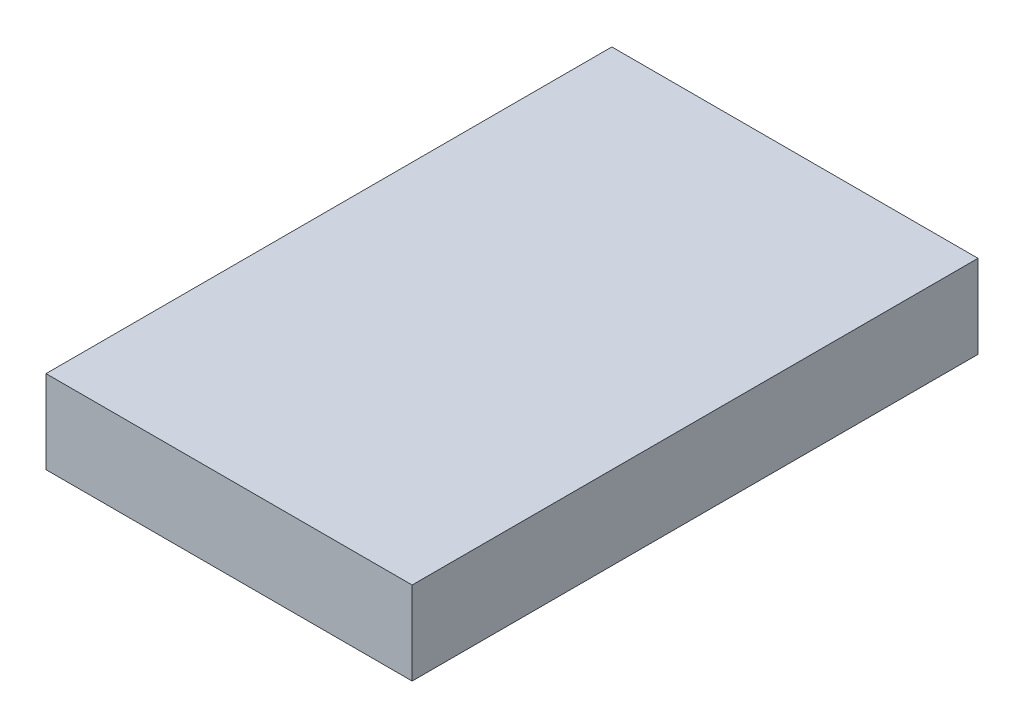
ISO-10303-21;
HEADER;
FILE_DESCRIPTION(('STEP AP214'),'2;1');
FILE_NAME('part.step','',(''),(''),'','','');
FILE_SCHEMA(('AUTOMOTIVE_DESIGN { 1 0 10303 214 1 1 1 1 }'));
ENDSEC;
DATA;
#1=APPLICATION_CONTEXT('core data for automotive mechanical design processes');
#2=APPLICATION_PROTOCOL_DEFINITION('international standard','automotive_design',2000,#1);
#3=PRODUCT_CONTEXT('',#1,'mechanical');
#4=PRODUCT('Part','Part','',(#3));
#5=PRODUCT_RELATED_PRODUCT_CATEGORY('part','',(#4));
#6=PRODUCT_DEFINITION_FORMATION('','',#4);
#7=PRODUCT_DEFINITION_CONTEXT('part definition',#1,'design');
#8=PRODUCT_DEFINITION('design','',#6,#7);
#9=PRODUCT_DEFINITION_SHAPE('','',#8);
#10=(LENGTH_UNIT() NAMED_UNIT(*) SI_UNIT(.MILLI.,.METRE.));
#11=(NAMED_UNIT(*) PLANE_ANGLE_UNIT() SI_UNIT($,.RADIAN.));
#12=(NAMED_UNIT(*) SI_UNIT($,.STERADIAN.) SOLID_ANGLE_UNIT());
#13=UNCERTAINTY_MEASURE_WITH_UNIT(LENGTH_MEASURE(1.E-05),#10,'distance_accuracy_value','');
#14=(GEOMETRIC_REPRESENTATION_CONTEXT(3) GLOBAL_UNCERTAINTY_ASSIGNED_CONTEXT((#13)) GLOBAL_UNIT_ASSIGNED_CONTEXT((#10,
#11,#12)) REPRESENTATION_CONTEXT('',''));
#15=CARTESIAN_POINT('',(0.,0.,0.));
#16=DIRECTION('',(0.,0.,1.));
#17=DIRECTION('',(1.,0.,0.));
#18=AXIS2_PLACEMENT_3D('',#15,#16,#17);
#19=CARTESIAN_POINT('',(20.9565685828294,2.5,-38.6881605759717));
#20=DIRECTION('',(1.,0.,0.));
#21=DIRECTION('',(0.,0.,-1.));
#22=AXIS2_PLACEMENT_3D('',#19,#20,#21);
#23=PLANE('',#22);
#24=DIRECTION('',(0.,0.,1.));
#25=VECTOR('',#24,1.);
#26=CARTESIAN_POINT('',(20.9565685828294,0.,-38.6881605759717));
#27=LINE('',#26,#25);
#28=CARTESIAN_POINT('',(20.9565685828294,0.,-38.6881605759717));
#29=VERTEX_POINT('',#28);
#30=CARTESIAN_POINT('',(20.9565685828294,0.,-21.6881605759717));
#31=VERTEX_POINT('',#30);
#32=EDGE_CURVE('E98',#29,#31,#27,.T.);
#33=ORIENTED_EDGE('',*,*,#32,.T.);
#34=DIRECTION('',(0.,-1.,0.));
#35=VECTOR('',#34,1.);
#36=CARTESIAN_POINT('',(20.9565685828294,2.5,-21.6881605759717));
#37=LINE('',#36,#35);
#38=CARTESIAN_POINT('',(20.9565685828294,2.5,-21.6881605759717));
#39=VERTEX_POINT('',#38);
#40=EDGE_CURVE('E11',#39,#31,#37,.T.);
#41=ORIENTED_EDGE('',*,*,#40,.F.);
#42=DIRECTION('',(0.,0.,1.));
#43=VECTOR('',#42,1.);
#44=CARTESIAN_POINT('',(20.9565685828294,2.5,-38.6881605759717));
#45=LINE('',#44,#43);
#46=CARTESIAN_POINT('',(20.9565685828294,2.5,-38.6881605759717));
#47=VERTEX_POINT('',#46);
#48=EDGE_CURVE('E86',#47,#39,#45,.T.);
#49=ORIENTED_EDGE('',*,*,#48,.F.);
#50=DIRECTION('',(0.,-1.,0.));
#51=VECTOR('',#50,1.);
#52=CARTESIAN_POINT('',(20.9565685828294,2.5,-38.6881605759717));
#53=LINE('',#52,#51);
#54=EDGE_CURVE('E94',#47,#29,#53,.T.);
#55=ORIENTED_EDGE('',*,*,#54,.T.);
#56=EDGE_LOOP('',(#33,#41,#49,#55));
#57=FACE_BOUND('',#56,.T.);
#58=ADVANCED_FACE('F35',(#57),#23,.F.);
#59=CARTESIAN_POINT('',(20.9565685828294,2.5,-21.6881605759717));
#60=DIRECTION('',(0.,0.,-1.));
#61=DIRECTION('',(-1.,0.,0.));
#62=AXIS2_PLACEMENT_3D('',#59,#60,#61);
#63=PLANE('',#62);
#64=DIRECTION('',(1.,0.,0.));
#65=VECTOR('',#64,1.);
#66=CARTESIAN_POINT('',(20.9565685828294,0.,-21.6881605759717));
#67=LINE('',#66,#65);
#68=CARTESIAN_POINT('',(31.9565685828294,0.,-21.6881605759717));
#69=VERTEX_POINT('',#68);
#70=EDGE_CURVE('E90',#31,#69,#67,.T.);
#71=ORIENTED_EDGE('',*,*,#70,.T.);
#72=DIRECTION('',(0.,-1.,0.));
#73=VECTOR('',#72,1.);
#74=CARTESIAN_POINT('',(31.9565685828294,2.5,-21.6881605759717));
#75=LINE('',#74,#73);
#76=CARTESIAN_POINT('',(31.9565685828294,2.5,-21.6881605759717));
#77=VERTEX_POINT('',#76);
#78=EDGE_CURVE('E43',#77,#69,#75,.T.);
#79=ORIENTED_EDGE('',*,*,#78,.F.);
#80=DIRECTION('',(1.,0.,0.));
#81=VECTOR('',#80,1.);
#82=CARTESIAN_POINT('',(20.9565685828294,2.5,-21.6881605759717));
#83=LINE('',#82,#81);
#84=EDGE_CURVE('E81',#39,#77,#83,.T.);
#85=ORIENTED_EDGE('',*,*,#84,.F.);
#86=ORIENTED_EDGE('',*,*,#40,.T.);
#87=EDGE_LOOP('',(#71,#79,#85,#86));
#88=FACE_BOUND('',#87,.T.);
#89=ADVANCED_FACE('F89',(#88),#63,.F.);
#90=CARTESIAN_POINT('',(31.9565685828294,2.5,-38.6881605759717));
#91=DIRECTION('',(-1.,0.,0.));
#92=DIRECTION('',(0.,0.,1.));
#93=AXIS2_PLACEMENT_3D('',#90,#91,#92);
#94=PLANE('',#93);
#95=DIRECTION('',(0.,0.,-1.));
#96=VECTOR('',#95,1.);
#97=CARTESIAN_POINT('',(31.9565685828294,0.,-38.6881605759717));
#98=LINE('',#97,#96);
#99=CARTESIAN_POINT('',(31.9565685828294,0.,-38.6881605759717));
#100=VERTEX_POINT('',#99);
#101=EDGE_CURVE('E68',#69,#100,#98,.T.);
#102=ORIENTED_EDGE('',*,*,#101,.T.);
#103=DIRECTION('',(0.,-1.,0.));
#104=VECTOR('',#103,1.);
#105=CARTESIAN_POINT('',(31.9565685828294,2.5,-38.6881605759717));
#106=LINE('',#105,#104);
#107=CARTESIAN_POINT('',(31.9565685828294,2.5,-38.6881605759717));
#108=VERTEX_POINT('',#107);
#109=EDGE_CURVE('E91',#108,#100,#106,.T.);
#110=ORIENTED_EDGE('',*,*,#109,.F.);
#111=DIRECTION('',(0.,0.,-1.));
#112=VECTOR('',#111,1.);
#113=CARTESIAN_POINT('',(31.9565685828294,2.5,-38.6881605759717));
#114=LINE('',#113,#112);
#115=EDGE_CURVE('E84',#77,#108,#114,.T.);
#116=ORIENTED_EDGE('',*,*,#115,.F.);
#117=ORIENTED_EDGE('',*,*,#78,.T.);
#118=EDGE_LOOP('',(#102,#110,#116,#117));
#119=FACE_BOUND('',#118,.T.);
#120=ADVANCED_FACE('F92',(#119),#94,.F.);
#121=CARTESIAN_POINT('',(20.9565685828294,2.5,-38.6881605759717));
#122=DIRECTION('',(0.,0.,1.));
#123=DIRECTION('',(1.,0.,0.));
#124=AXIS2_PLACEMENT_3D('',#121,#122,#123);
#125=PLANE('',#124);
#126=DIRECTION('',(-1.,0.,0.));
#127=VECTOR('',#126,1.);
#128=CARTESIAN_POINT('',(20.9565685828294,0.,-38.6881605759717));
#129=LINE('',#128,#127);
#130=EDGE_CURVE('E74',#100,#29,#129,.T.);
#131=ORIENTED_EDGE('',*,*,#130,.T.);
#132=ORIENTED_EDGE('',*,*,#54,.F.);
#133=DIRECTION('',(-1.,0.,0.));
#134=VECTOR('',#133,1.);
#135=CARTESIAN_POINT('',(20.9565685828294,2.5,-38.6881605759717));
#136=LINE('',#135,#134);
#137=EDGE_CURVE('E51',#108,#47,#136,.T.);
#138=ORIENTED_EDGE('',*,*,#137,.F.);
#139=ORIENTED_EDGE('',*,*,#109,.T.);
#140=EDGE_LOOP('',(#131,#132,#138,#139));
#141=FACE_BOUND('',#140,.T.);
#142=ADVANCED_FACE('F105',(#141),#125,.F.);
#143=CARTESIAN_POINT('',(0.,2.5,0.));
#144=DIRECTION('',(0.,1.,0.));
#145=DIRECTION('',(0.,0.,1.));
#146=AXIS2_PLACEMENT_3D('',#143,#144,#145);
#147=PLANE('',#146);
#148=ORIENTED_EDGE('',*,*,#48,.T.);
#149=ORIENTED_EDGE('',*,*,#84,.T.);
#150=ORIENTED_EDGE('',*,*,#115,.T.);
#151=ORIENTED_EDGE('',*,*,#137,.T.);
#152=EDGE_LOOP('',(#148,#149,#150,#151));
#153=FACE_BOUND('',#152,.T.);
#154=ADVANCED_FACE('F82',(#153),#147,.T.);
#155=CARTESIAN_POINT('',(0.,0.,0.));
#156=DIRECTION('',(0.,1.,0.));
#157=DIRECTION('',(0.,0.,1.));
#158=AXIS2_PLACEMENT_3D('',#155,#156,#157);
#159=PLANE('',#158);
#160=ORIENTED_EDGE('',*,*,#32,.F.);
#161=ORIENTED_EDGE('',*,*,#130,.F.);
#162=ORIENTED_EDGE('',*,*,#101,.F.);
#163=ORIENTED_EDGE('',*,*,#70,.F.);
#164=EDGE_LOOP('',(#160,#161,#162,#163));
#165=FACE_BOUND('',#164,.T.);
#166=ADVANCED_FACE('F108',(#165),#159,.F.);
#167=CLOSED_SHELL('',(#58,#89,#120,#142,#154,#166));
#168=MANIFOLD_SOLID_BREP('B2',#167);
#169=ADVANCED_BREP_SHAPE_REPRESENTATION('',(#18,#168),#14);
#170=SHAPE_DEFINITION_REPRESENTATION(#9,#169);
ENDSEC;
END-ISO-10303-21;
